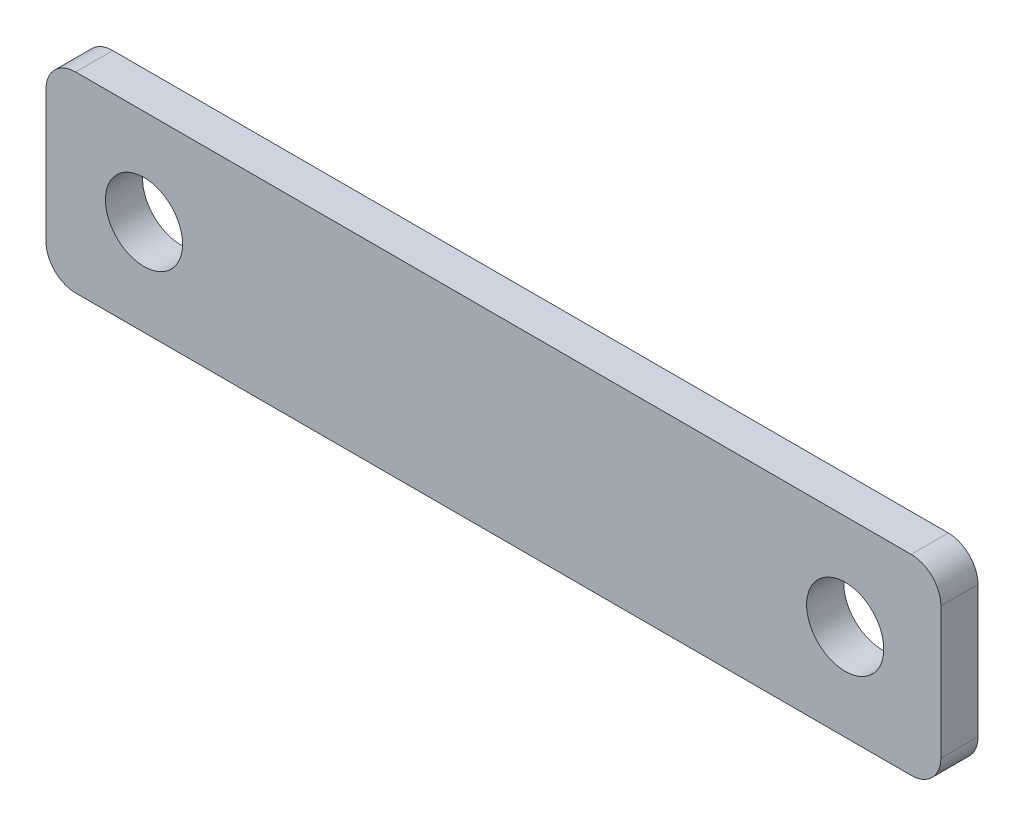
ISO-10303-21;
HEADER;
FILE_DESCRIPTION(('STEP AP214'),'2;1');
FILE_NAME('part.step','',(''),(''),'','','');
FILE_SCHEMA(('AUTOMOTIVE_DESIGN { 1 0 10303 214 1 1 1 1 }'));
ENDSEC;
DATA;
#1=APPLICATION_CONTEXT('core data for automotive mechanical design processes');
#2=APPLICATION_PROTOCOL_DEFINITION('international standard','automotive_design',2000,#1);
#3=PRODUCT_CONTEXT('',#1,'mechanical');
#4=PRODUCT('Part','Part','',(#3));
#5=PRODUCT_RELATED_PRODUCT_CATEGORY('part','',(#4));
#6=PRODUCT_DEFINITION_FORMATION('','',#4);
#7=PRODUCT_DEFINITION_CONTEXT('part definition',#1,'design');
#8=PRODUCT_DEFINITION('design','',#6,#7);
#9=PRODUCT_DEFINITION_SHAPE('','',#8);
#10=(LENGTH_UNIT() NAMED_UNIT(*) SI_UNIT(.MILLI.,.METRE.));
#11=(NAMED_UNIT(*) PLANE_ANGLE_UNIT() SI_UNIT($,.RADIAN.));
#12=(NAMED_UNIT(*) SI_UNIT($,.STERADIAN.) SOLID_ANGLE_UNIT());
#13=UNCERTAINTY_MEASURE_WITH_UNIT(LENGTH_MEASURE(1.E-05),#10,'distance_accuracy_value','');
#14=(GEOMETRIC_REPRESENTATION_CONTEXT(3) GLOBAL_UNCERTAINTY_ASSIGNED_CONTEXT((#13)) GLOBAL_UNIT_ASSIGNED_CONTEXT((#10,
#11,#12)) REPRESENTATION_CONTEXT('',''));
#15=CARTESIAN_POINT('',(0.,0.,0.));
#16=DIRECTION('',(0.,0.,1.));
#17=DIRECTION('',(1.,0.,0.));
#18=AXIS2_PLACEMENT_3D('',#15,#16,#17);
#19=CARTESIAN_POINT('',(-22.7939000000007,-78.501600001232,-3.175));
#20=DIRECTION('',(-1.,0.,0.));
#21=DIRECTION('',(0.,0.,1.));
#22=AXIS2_PLACEMENT_3D('',#19,#20,#21);
#23=PLANE('',#22);
#24=DIRECTION('',(0.,-1.,0.));
#25=VECTOR('',#24,1.);
#26=CARTESIAN_POINT('',(-22.7939000000007,-78.501600001232,0.));
#27=LINE('',#26,#25);
#28=CARTESIAN_POINT('',(-22.7939000000007,-64.663600001232,0.));
#29=VERTEX_POINT('',#28);
#30=CARTESIAN_POINT('',(-22.7939000000007,-75.961600001232,0.));
#31=VERTEX_POINT('',#30);
#32=EDGE_CURVE('E111',#29,#31,#27,.T.);
#33=ORIENTED_EDGE('',*,*,#32,.F.);
#34=DIRECTION('',(0.,0.,1.));
#35=VECTOR('',#34,1.);
#36=CARTESIAN_POINT('',(-22.7939000000007,-64.663600001232,-3.175));
#37=LINE('',#36,#35);
#38=CARTESIAN_POINT('',(-22.7939000000007,-64.663600001232,-3.175));
#39=VERTEX_POINT('',#38);
#40=EDGE_CURVE('E11',#29,#39,#37,.F.);
#41=ORIENTED_EDGE('',*,*,#40,.T.);
#42=DIRECTION('',(0.,-1.,0.));
#43=VECTOR('',#42,1.);
#44=CARTESIAN_POINT('',(-22.7939000000007,-78.501600001232,-3.175));
#45=LINE('',#44,#43);
#46=CARTESIAN_POINT('',(-22.7939000000007,-75.961600001232,-3.175));
#47=VERTEX_POINT('',#46);
#48=EDGE_CURVE('E161',#39,#47,#45,.T.);
#49=ORIENTED_EDGE('',*,*,#48,.T.);
#50=DIRECTION('',(0.,0.,1.));
#51=VECTOR('',#50,1.);
#52=CARTESIAN_POINT('',(-22.7939000000007,-75.961600001232,-3.175));
#53=LINE('',#52,#51);
#54=EDGE_CURVE('E48',#47,#31,#53,.T.);
#55=ORIENTED_EDGE('',*,*,#54,.T.);
#56=EDGE_LOOP('',(#33,#41,#49,#55));
#57=FACE_BOUND('',#56,.T.);
#58=ADVANCED_FACE('F40',(#57),#23,.T.);
#59=CARTESIAN_POINT('',(53.7718999999985,-62.123600001232,-3.175));
#60=DIRECTION('',(0.,1.,0.));
#61=DIRECTION('',(0.,0.,1.));
#62=AXIS2_PLACEMENT_3D('',#59,#60,#61);
#63=PLANE('',#62);
#64=DIRECTION('',(-1.,0.,0.));
#65=VECTOR('',#64,1.);
#66=CARTESIAN_POINT('',(53.7718999999985,-62.123600001232,0.));
#67=LINE('',#66,#65);
#68=CARTESIAN_POINT('',(51.2318999999985,-62.123600001232,0.));
#69=VERTEX_POINT('',#68);
#70=CARTESIAN_POINT('',(-20.2539000000007,-62.123600001232,0.));
#71=VERTEX_POINT('',#70);
#72=EDGE_CURVE('E136',#69,#71,#67,.T.);
#73=ORIENTED_EDGE('',*,*,#72,.F.);
#74=DIRECTION('',(0.,0.,1.));
#75=VECTOR('',#74,1.);
#76=CARTESIAN_POINT('',(51.2318999999985,-62.123600001232,-3.175));
#77=LINE('',#76,#75);
#78=CARTESIAN_POINT('',(51.2318999999985,-62.123600001232,-3.175));
#79=VERTEX_POINT('',#78);
#80=EDGE_CURVE('E62',#69,#79,#77,.F.);
#81=ORIENTED_EDGE('',*,*,#80,.T.);
#82=DIRECTION('',(-1.,0.,0.));
#83=VECTOR('',#82,1.);
#84=CARTESIAN_POINT('',(53.7718999999985,-62.123600001232,-3.175));
#85=LINE('',#84,#83);
#86=CARTESIAN_POINT('',(-20.2539000000007,-62.123600001232,-3.175));
#87=VERTEX_POINT('',#86);
#88=EDGE_CURVE('E130',#79,#87,#85,.T.);
#89=ORIENTED_EDGE('',*,*,#88,.T.);
#90=DIRECTION('',(0.,0.,1.));
#91=VECTOR('',#90,1.);
#92=CARTESIAN_POINT('',(-20.2539000000007,-62.123600001232,-3.175));
#93=LINE('',#92,#91);
#94=EDGE_CURVE('E155',#87,#71,#93,.T.);
#95=ORIENTED_EDGE('',*,*,#94,.T.);
#96=EDGE_LOOP('',(#73,#81,#89,#95));
#97=FACE_BOUND('',#96,.T.);
#98=ADVANCED_FACE('F197',(#97),#63,.T.);
#99=CARTESIAN_POINT('',(53.7718999999985,-62.123600001232,-3.175));
#100=DIRECTION('',(1.,0.,0.));
#101=DIRECTION('',(0.,0.,-1.));
#102=AXIS2_PLACEMENT_3D('',#99,#100,#101);
#103=PLANE('',#102);
#104=DIRECTION('',(0.,1.,0.));
#105=VECTOR('',#104,1.);
#106=CARTESIAN_POINT('',(53.7718999999985,-62.123600001232,0.));
#107=LINE('',#106,#105);
#108=CARTESIAN_POINT('',(53.7718999999985,-75.961600001232,0.));
#109=VERTEX_POINT('',#108);
#110=CARTESIAN_POINT('',(53.7718999999985,-64.663600001232,0.));
#111=VERTEX_POINT('',#110);
#112=EDGE_CURVE('E126',#109,#111,#107,.T.);
#113=ORIENTED_EDGE('',*,*,#112,.F.);
#114=DIRECTION('',(0.,0.,1.));
#115=VECTOR('',#114,1.);
#116=CARTESIAN_POINT('',(53.7718999999985,-75.961600001232,-3.175));
#117=LINE('',#116,#115);
#118=CARTESIAN_POINT('',(53.7718999999985,-75.961600001232,-3.175));
#119=VERTEX_POINT('',#118);
#120=EDGE_CURVE('E147',#109,#119,#117,.F.);
#121=ORIENTED_EDGE('',*,*,#120,.T.);
#122=DIRECTION('',(0.,1.,0.));
#123=VECTOR('',#122,1.);
#124=CARTESIAN_POINT('',(53.7718999999985,-62.123600001232,-3.175));
#125=LINE('',#124,#123);
#126=CARTESIAN_POINT('',(53.7718999999985,-64.663600001232,-3.175));
#127=VERTEX_POINT('',#126);
#128=EDGE_CURVE('E133',#119,#127,#125,.T.);
#129=ORIENTED_EDGE('',*,*,#128,.T.);
#130=DIRECTION('',(0.,0.,1.));
#131=VECTOR('',#130,1.);
#132=CARTESIAN_POINT('',(53.7718999999985,-64.663600001232,-3.175));
#133=LINE('',#132,#131);
#134=EDGE_CURVE('E144',#127,#111,#133,.T.);
#135=ORIENTED_EDGE('',*,*,#134,.T.);
#136=EDGE_LOOP('',(#113,#121,#129,#135));
#137=FACE_BOUND('',#136,.T.);
#138=ADVANCED_FACE('F176',(#137),#103,.T.);
#139=CARTESIAN_POINT('',(53.7718999999985,-78.501600001232,-3.175));
#140=DIRECTION('',(0.,-1.,0.));
#141=DIRECTION('',(0.,0.,-1.));
#142=AXIS2_PLACEMENT_3D('',#139,#140,#141);
#143=PLANE('',#142);
#144=DIRECTION('',(1.,0.,0.));
#145=VECTOR('',#144,1.);
#146=CARTESIAN_POINT('',(53.7718999999985,-78.501600001232,-3.175));
#147=LINE('',#146,#145);
#148=CARTESIAN_POINT('',(-20.2539000000007,-78.501600001232,-3.175));
#149=VERTEX_POINT('',#148);
#150=CARTESIAN_POINT('',(51.2318999999985,-78.501600001232,-3.175));
#151=VERTEX_POINT('',#150);
#152=EDGE_CURVE('E162',#149,#151,#147,.T.);
#153=ORIENTED_EDGE('',*,*,#152,.T.);
#154=DIRECTION('',(0.,0.,1.));
#155=VECTOR('',#154,1.);
#156=CARTESIAN_POINT('',(51.2318999999985,-78.501600001232,-3.175));
#157=LINE('',#156,#155);
#158=CARTESIAN_POINT('',(51.2318999999985,-78.501600001232,0.));
#159=VERTEX_POINT('',#158);
#160=EDGE_CURVE('E117',#151,#159,#157,.T.);
#161=ORIENTED_EDGE('',*,*,#160,.T.);
#162=DIRECTION('',(1.,0.,0.));
#163=VECTOR('',#162,1.);
#164=CARTESIAN_POINT('',(53.7718999999985,-78.501600001232,0.));
#165=LINE('',#164,#163);
#166=CARTESIAN_POINT('',(-20.2539000000007,-78.501600001232,0.));
#167=VERTEX_POINT('',#166);
#168=EDGE_CURVE('E109',#167,#159,#165,.T.);
#169=ORIENTED_EDGE('',*,*,#168,.F.);
#170=DIRECTION('',(0.,0.,1.));
#171=VECTOR('',#170,1.);
#172=CARTESIAN_POINT('',(-20.2539000000007,-78.501600001232,-3.175));
#173=LINE('',#172,#171);
#174=EDGE_CURVE('E123',#167,#149,#173,.F.);
#175=ORIENTED_EDGE('',*,*,#174,.T.);
#176=EDGE_LOOP('',(#153,#161,#169,#175));
#177=FACE_BOUND('',#176,.T.);
#178=ADVANCED_FACE('F122',(#177),#143,.T.);
#179=CARTESIAN_POINT('',(0.,0.,-3.175));
#180=DIRECTION('',(0.,0.,1.));
#181=DIRECTION('',(1.,0.,0.));
#182=AXIS2_PLACEMENT_3D('',#179,#180,#181);
#183=PLANE('',#182);
#184=CARTESIAN_POINT('',(-14.4119000000007,-70.312600001232,-3.175));
#185=DIRECTION('',(0.,0.,1.));
#186=DIRECTION('',(1.,0.,0.));
#187=AXIS2_PLACEMENT_3D('',#184,#185,#186);
#188=CIRCLE('',#187,3.3);
#189=CARTESIAN_POINT('',(-11.1119000000007,-70.312600001232,-3.175));
#190=VERTEX_POINT('',#189);
#191=EDGE_CURVE('E225',#190,#190,#188,.T.);
#192=ORIENTED_EDGE('',*,*,#191,.T.);
#193=EDGE_LOOP('',(#192));
#194=FACE_BOUND('',#193,.T.);
#195=CARTESIAN_POINT('',(45.5828999999993,-70.312600001231,-3.175));
#196=DIRECTION('',(0.,0.,1.));
#197=DIRECTION('',(1.,0.,0.));
#198=AXIS2_PLACEMENT_3D('',#195,#196,#197);
#199=CIRCLE('',#198,3.3);
#200=CARTESIAN_POINT('',(48.8828999999993,-70.312600001231,-3.175));
#201=VERTEX_POINT('',#200);
#202=EDGE_CURVE('E167',#201,#201,#199,.T.);
#203=ORIENTED_EDGE('',*,*,#202,.T.);
#204=EDGE_LOOP('',(#203));
#205=FACE_BOUND('',#204,.T.);
#206=ORIENTED_EDGE('',*,*,#128,.F.);
#207=CARTESIAN_POINT('',(51.2318999999985,-75.961600001232,-3.175));
#208=DIRECTION('',(0.,0.,1.));
#209=DIRECTION('',(1.,0.,0.));
#210=AXIS2_PLACEMENT_3D('',#207,#208,#209);
#211=CIRCLE('',#210,2.54);
#212=EDGE_CURVE('E153',#119,#151,#211,.F.);
#213=ORIENTED_EDGE('',*,*,#212,.T.);
#214=ORIENTED_EDGE('',*,*,#152,.F.);
#215=CARTESIAN_POINT('',(-20.2539000000007,-75.961600001232,-3.175));
#216=DIRECTION('',(0.,0.,1.));
#217=DIRECTION('',(1.,0.,0.));
#218=AXIS2_PLACEMENT_3D('',#215,#216,#217);
#219=CIRCLE('',#218,2.54);
#220=EDGE_CURVE('E129',#149,#47,#219,.F.);
#221=ORIENTED_EDGE('',*,*,#220,.T.);
#222=ORIENTED_EDGE('',*,*,#48,.F.);
#223=CARTESIAN_POINT('',(-20.2539000000007,-64.663600001232,-3.175));
#224=DIRECTION('',(0.,0.,1.));
#225=DIRECTION('',(1.,0.,0.));
#226=AXIS2_PLACEMENT_3D('',#223,#224,#225);
#227=CIRCLE('',#226,2.54);
#228=EDGE_CURVE('E55',#39,#87,#227,.F.);
#229=ORIENTED_EDGE('',*,*,#228,.T.);
#230=ORIENTED_EDGE('',*,*,#88,.F.);
#231=CARTESIAN_POINT('',(51.2318999999985,-64.663600001232,-3.175));
#232=DIRECTION('',(0.,0.,1.));
#233=DIRECTION('',(1.,0.,0.));
#234=AXIS2_PLACEMENT_3D('',#231,#232,#233);
#235=CIRCLE('',#234,2.54);
#236=EDGE_CURVE('E151',#79,#127,#235,.F.);
#237=ORIENTED_EDGE('',*,*,#236,.T.);
#238=EDGE_LOOP('',(#206,#213,#214,#221,#222,#229,#230,#237));
#239=FACE_BOUND('',#238,.T.);
#240=ADVANCED_FACE('F182',(#194,#205,#239),#183,.F.);
#241=CARTESIAN_POINT('',(0.,0.,0.));
#242=DIRECTION('',(0.,0.,1.));
#243=DIRECTION('',(1.,0.,0.));
#244=AXIS2_PLACEMENT_3D('',#241,#242,#243);
#245=PLANE('',#244);
#246=CARTESIAN_POINT('',(-14.4119000000007,-70.312600001232,0.));
#247=DIRECTION('',(0.,0.,1.));
#248=DIRECTION('',(1.,0.,0.));
#249=AXIS2_PLACEMENT_3D('',#246,#247,#248);
#250=CIRCLE('',#249,3.3);
#251=CARTESIAN_POINT('',(-11.1119000000007,-70.312600001232,0.));
#252=VERTEX_POINT('',#251);
#253=EDGE_CURVE('E228',#252,#252,#250,.T.);
#254=ORIENTED_EDGE('',*,*,#253,.F.);
#255=EDGE_LOOP('',(#254));
#256=FACE_BOUND('',#255,.T.);
#257=CARTESIAN_POINT('',(45.5828999999993,-70.312600001231,0.));
#258=DIRECTION('',(0.,0.,1.));
#259=DIRECTION('',(1.,0.,0.));
#260=AXIS2_PLACEMENT_3D('',#257,#258,#259);
#261=CIRCLE('',#260,3.3);
#262=CARTESIAN_POINT('',(48.8828999999993,-70.312600001231,0.));
#263=VERTEX_POINT('',#262);
#264=EDGE_CURVE('E230',#263,#263,#261,.T.);
#265=ORIENTED_EDGE('',*,*,#264,.F.);
#266=EDGE_LOOP('',(#265));
#267=FACE_BOUND('',#266,.T.);
#268=ORIENTED_EDGE('',*,*,#168,.T.);
#269=CARTESIAN_POINT('',(51.2318999999985,-75.961600001232,0.));
#270=DIRECTION('',(0.,0.,1.));
#271=DIRECTION('',(1.,0.,0.));
#272=AXIS2_PLACEMENT_3D('',#269,#270,#271);
#273=CIRCLE('',#272,2.54);
#274=EDGE_CURVE('E142',#159,#109,#273,.T.);
#275=ORIENTED_EDGE('',*,*,#274,.T.);
#276=ORIENTED_EDGE('',*,*,#112,.T.);
#277=CARTESIAN_POINT('',(51.2318999999985,-64.663600001232,0.));
#278=DIRECTION('',(0.,0.,1.));
#279=DIRECTION('',(1.,0.,0.));
#280=AXIS2_PLACEMENT_3D('',#277,#278,#279);
#281=CIRCLE('',#280,2.54);
#282=EDGE_CURVE('E140',#111,#69,#281,.T.);
#283=ORIENTED_EDGE('',*,*,#282,.T.);
#284=ORIENTED_EDGE('',*,*,#72,.T.);
#285=CARTESIAN_POINT('',(-20.2539000000007,-64.663600001232,0.));
#286=DIRECTION('',(0.,0.,1.));
#287=DIRECTION('',(1.,0.,0.));
#288=AXIS2_PLACEMENT_3D('',#285,#286,#287);
#289=CIRCLE('',#288,2.54);
#290=EDGE_CURVE('E116',#71,#29,#289,.T.);
#291=ORIENTED_EDGE('',*,*,#290,.T.);
#292=ORIENTED_EDGE('',*,*,#32,.T.);
#293=CARTESIAN_POINT('',(-20.2539000000007,-75.961600001232,0.));
#294=DIRECTION('',(0.,0.,1.));
#295=DIRECTION('',(1.,0.,0.));
#296=AXIS2_PLACEMENT_3D('',#293,#294,#295);
#297=CIRCLE('',#296,2.54);
#298=EDGE_CURVE('E106',#31,#167,#297,.T.);
#299=ORIENTED_EDGE('',*,*,#298,.T.);
#300=EDGE_LOOP('',(#268,#275,#276,#283,#284,#291,#292,#299));
#301=FACE_BOUND('',#300,.T.);
#302=ADVANCED_FACE('F108',(#256,#267,#301),#245,.T.);
#303=CARTESIAN_POINT('',(45.5828999999993,-70.312600001231,0.));
#304=DIRECTION('',(0.,0.,1.));
#305=DIRECTION('',(1.,0.,0.));
#306=AXIS2_PLACEMENT_3D('',#303,#304,#305);
#307=CYLINDRICAL_SURFACE('',#306,3.3);
#308=ORIENTED_EDGE('',*,*,#202,.F.);
#309=EDGE_LOOP('',(#308));
#310=FACE_BOUND('',#309,.T.);
#311=ORIENTED_EDGE('',*,*,#264,.T.);
#312=EDGE_LOOP('',(#311));
#313=FACE_BOUND('',#312,.T.);
#314=ADVANCED_FACE('F210',(#310,#313),#307,.F.);
#315=CARTESIAN_POINT('',(-14.4119000000007,-70.312600001232,0.));
#316=DIRECTION('',(0.,0.,1.));
#317=DIRECTION('',(1.,0.,0.));
#318=AXIS2_PLACEMENT_3D('',#315,#316,#317);
#319=CYLINDRICAL_SURFACE('',#318,3.3);
#320=ORIENTED_EDGE('',*,*,#191,.F.);
#321=EDGE_LOOP('',(#320));
#322=FACE_BOUND('',#321,.T.);
#323=ORIENTED_EDGE('',*,*,#253,.T.);
#324=EDGE_LOOP('',(#323));
#325=FACE_BOUND('',#324,.T.);
#326=ADVANCED_FACE('F194',(#322,#325),#319,.F.);
#327=CARTESIAN_POINT('',(51.2318999999985,-75.961600001232,-3.175));
#328=DIRECTION('',(0.,0.,1.));
#329=DIRECTION('',(1.,0.,0.));
#330=AXIS2_PLACEMENT_3D('',#327,#328,#329);
#331=CYLINDRICAL_SURFACE('',#330,2.54);
#332=ORIENTED_EDGE('',*,*,#212,.F.);
#333=ORIENTED_EDGE('',*,*,#120,.F.);
#334=ORIENTED_EDGE('',*,*,#274,.F.);
#335=ORIENTED_EDGE('',*,*,#160,.F.);
#336=EDGE_LOOP('',(#332,#333,#334,#335));
#337=FACE_BOUND('',#336,.T.);
#338=ADVANCED_FACE('F181',(#337),#331,.T.);
#339=CARTESIAN_POINT('',(51.2318999999985,-64.663600001232,-3.175));
#340=DIRECTION('',(0.,0.,1.));
#341=DIRECTION('',(1.,0.,0.));
#342=AXIS2_PLACEMENT_3D('',#339,#340,#341);
#343=CYLINDRICAL_SURFACE('',#342,2.54);
#344=ORIENTED_EDGE('',*,*,#236,.F.);
#345=ORIENTED_EDGE('',*,*,#80,.F.);
#346=ORIENTED_EDGE('',*,*,#282,.F.);
#347=ORIENTED_EDGE('',*,*,#134,.F.);
#348=EDGE_LOOP('',(#344,#345,#346,#347));
#349=FACE_BOUND('',#348,.T.);
#350=ADVANCED_FACE('F185',(#349),#343,.T.);
#351=CARTESIAN_POINT('',(-20.2539000000007,-64.663600001232,-3.175));
#352=DIRECTION('',(0.,0.,1.));
#353=DIRECTION('',(1.,0.,0.));
#354=AXIS2_PLACEMENT_3D('',#351,#352,#353);
#355=CYLINDRICAL_SURFACE('',#354,2.54);
#356=ORIENTED_EDGE('',*,*,#228,.F.);
#357=ORIENTED_EDGE('',*,*,#40,.F.);
#358=ORIENTED_EDGE('',*,*,#290,.F.);
#359=ORIENTED_EDGE('',*,*,#94,.F.);
#360=EDGE_LOOP('',(#356,#357,#358,#359));
#361=FACE_BOUND('',#360,.T.);
#362=ADVANCED_FACE('F187',(#361),#355,.T.);
#363=CARTESIAN_POINT('',(-20.2539000000007,-75.961600001232,-3.175));
#364=DIRECTION('',(0.,0.,1.));
#365=DIRECTION('',(1.,0.,0.));
#366=AXIS2_PLACEMENT_3D('',#363,#364,#365);
#367=CYLINDRICAL_SURFACE('',#366,2.54);
#368=ORIENTED_EDGE('',*,*,#220,.F.);
#369=ORIENTED_EDGE('',*,*,#174,.F.);
#370=ORIENTED_EDGE('',*,*,#298,.F.);
#371=ORIENTED_EDGE('',*,*,#54,.F.);
#372=EDGE_LOOP('',(#368,#369,#370,#371));
#373=FACE_BOUND('',#372,.T.);
#374=ADVANCED_FACE('F42',(#373),#367,.T.);
#375=CLOSED_SHELL('',(#58,#98,#138,#178,#240,#302,#314,#326,#338,#350,#362,#374));
#376=MANIFOLD_SOLID_BREP('B2',#375);
#377=ADVANCED_BREP_SHAPE_REPRESENTATION('',(#18,#376),#14);
#378=SHAPE_DEFINITION_REPRESENTATION(#9,#377);
ENDSEC;
END-ISO-10303-21;
